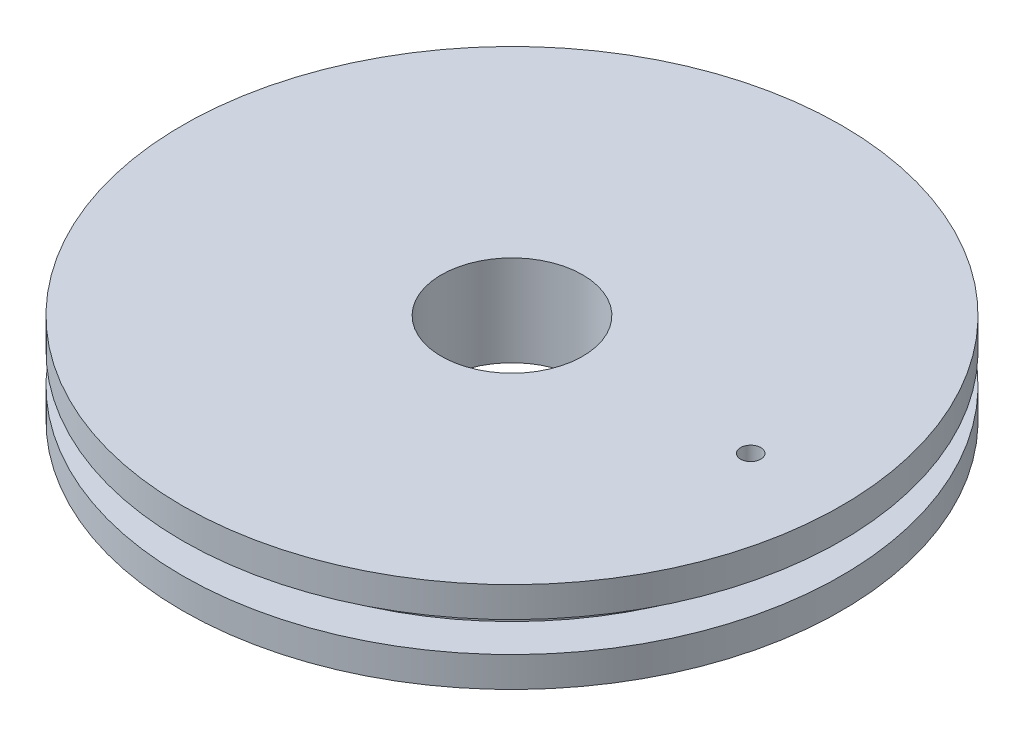
ISO-10303-21;
HEADER;
FILE_DESCRIPTION(('STEP AP214'),'2;1');
FILE_NAME('part.step','',(''),(''),'','','');
FILE_SCHEMA(('AUTOMOTIVE_DESIGN { 1 0 10303 214 1 1 1 1 }'));
ENDSEC;
DATA;
#1=APPLICATION_CONTEXT('core data for automotive mechanical design processes');
#2=APPLICATION_PROTOCOL_DEFINITION('international standard','automotive_design',2000,#1);
#3=PRODUCT_CONTEXT('',#1,'mechanical');
#4=PRODUCT('Part','Part','',(#3));
#5=PRODUCT_RELATED_PRODUCT_CATEGORY('part','',(#4));
#6=PRODUCT_DEFINITION_FORMATION('','',#4);
#7=PRODUCT_DEFINITION_CONTEXT('part definition',#1,'design');
#8=PRODUCT_DEFINITION('design','',#6,#7);
#9=PRODUCT_DEFINITION_SHAPE('','',#8);
#10=(LENGTH_UNIT() NAMED_UNIT(*) SI_UNIT(.MILLI.,.METRE.));
#11=(NAMED_UNIT(*) PLANE_ANGLE_UNIT() SI_UNIT($,.RADIAN.));
#12=(NAMED_UNIT(*) SI_UNIT($,.STERADIAN.) SOLID_ANGLE_UNIT());
#13=UNCERTAINTY_MEASURE_WITH_UNIT(LENGTH_MEASURE(1.E-05),#10,'distance_accuracy_value','');
#14=(GEOMETRIC_REPRESENTATION_CONTEXT(3) GLOBAL_UNCERTAINTY_ASSIGNED_CONTEXT((#13)) GLOBAL_UNIT_ASSIGNED_CONTEXT((#10,
#11,#12)) REPRESENTATION_CONTEXT('',''));
#15=CARTESIAN_POINT('',(0.,0.,0.));
#16=DIRECTION('',(0.,0.,1.));
#17=DIRECTION('',(1.,0.,0.));
#18=AXIS2_PLACEMENT_3D('',#15,#16,#17);
#19=CARTESIAN_POINT('',(0.,0.,0.));
#20=DIRECTION('',(0.,-1.,0.));
#21=DIRECTION('',(0.,0.,-1.));
#22=AXIS2_PLACEMENT_3D('',#19,#20,#21);
#23=CYLINDRICAL_SURFACE('',#22,32.65);
#24=CARTESIAN_POINT('',(0.,4.5,0.));
#25=DIRECTION('',(0.,-1.,0.));
#26=DIRECTION('',(0.,0.,-1.));
#27=AXIS2_PLACEMENT_3D('',#24,#25,#26);
#28=CIRCLE('',#27,32.65);
#29=CARTESIAN_POINT('',(0.,4.5,-32.65));
#30=VERTEX_POINT('',#29);
#31=EDGE_CURVE('E67',#30,#30,#28,.T.);
#32=ORIENTED_EDGE('',*,*,#31,.T.);
#33=EDGE_LOOP('',(#32));
#34=FACE_BOUND('',#33,.T.);
#35=CARTESIAN_POINT('',(0.,1.5,0.));
#36=DIRECTION('',(0.,-1.,0.));
#37=DIRECTION('',(0.,0.,-1.));
#38=AXIS2_PLACEMENT_3D('',#35,#36,#37);
#39=CIRCLE('',#38,32.65);
#40=CARTESIAN_POINT('',(0.,1.5,-32.65));
#41=VERTEX_POINT('',#40);
#42=EDGE_CURVE('E10',#41,#41,#39,.T.);
#43=ORIENTED_EDGE('',*,*,#42,.F.);
#44=EDGE_LOOP('',(#43));
#45=FACE_BOUND('',#44,.T.);
#46=ADVANCED_FACE('F39',(#34,#45),#23,.T.);
#47=CARTESIAN_POINT('',(32.65,1.5,0.));
#48=DIRECTION('',(0.,-1.,0.));
#49=DIRECTION('',(0.,0.,-1.));
#50=AXIS2_PLACEMENT_3D('',#47,#48,#49);
#51=PLANE('',#50);
#52=ORIENTED_EDGE('',*,*,#42,.T.);
#53=EDGE_LOOP('',(#52));
#54=FACE_BOUND('',#53,.T.);
#55=CARTESIAN_POINT('',(0.,1.5,0.));
#56=DIRECTION('',(0.,-1.,0.));
#57=DIRECTION('',(0.,0.,-1.));
#58=AXIS2_PLACEMENT_3D('',#55,#56,#57);
#59=CIRCLE('',#58,28.65);
#60=CARTESIAN_POINT('',(0.,1.5,-28.65));
#61=VERTEX_POINT('',#60);
#62=EDGE_CURVE('E45',#61,#61,#59,.T.);
#63=ORIENTED_EDGE('',*,*,#62,.F.);
#64=EDGE_LOOP('',(#63));
#65=FACE_BOUND('',#64,.T.);
#66=ADVANCED_FACE('F97',(#54,#65),#51,.T.);
#67=CARTESIAN_POINT('',(0.,0.,0.));
#68=DIRECTION('',(0.,-1.,0.));
#69=DIRECTION('',(0.,0.,-1.));
#70=AXIS2_PLACEMENT_3D('',#67,#68,#69);
#71=CYLINDRICAL_SURFACE('',#70,28.65);
#72=ORIENTED_EDGE('',*,*,#62,.T.);
#73=EDGE_LOOP('',(#72));
#74=FACE_BOUND('',#73,.T.);
#75=CARTESIAN_POINT('',(0.,-1.5,0.));
#76=DIRECTION('',(0.,-1.,0.));
#77=DIRECTION('',(0.,0.,-1.));
#78=AXIS2_PLACEMENT_3D('',#75,#76,#77);
#79=CIRCLE('',#78,28.65);
#80=CARTESIAN_POINT('',(0.,-1.5,-28.65));
#81=VERTEX_POINT('',#80);
#82=EDGE_CURVE('E49',#81,#81,#79,.T.);
#83=ORIENTED_EDGE('',*,*,#82,.F.);
#84=EDGE_LOOP('',(#83));
#85=FACE_BOUND('',#84,.T.);
#86=ADVANCED_FACE('F101',(#74,#85),#71,.T.);
#87=CARTESIAN_POINT('',(32.65,-1.5,0.));
#88=DIRECTION('',(0.,1.,0.));
#89=DIRECTION('',(0.,0.,1.));
#90=AXIS2_PLACEMENT_3D('',#87,#88,#89);
#91=PLANE('',#90);
#92=ORIENTED_EDGE('',*,*,#82,.T.);
#93=EDGE_LOOP('',(#92));
#94=FACE_BOUND('',#93,.T.);
#95=CARTESIAN_POINT('',(0.,-1.5,0.));
#96=DIRECTION('',(0.,-1.,0.));
#97=DIRECTION('',(0.,0.,-1.));
#98=AXIS2_PLACEMENT_3D('',#95,#96,#97);
#99=CIRCLE('',#98,32.65);
#100=CARTESIAN_POINT('',(0.,-1.5,-32.65));
#101=VERTEX_POINT('',#100);
#102=EDGE_CURVE('E53',#101,#101,#99,.T.);
#103=ORIENTED_EDGE('',*,*,#102,.F.);
#104=EDGE_LOOP('',(#103));
#105=FACE_BOUND('',#104,.T.);
#106=ADVANCED_FACE('F105',(#94,#105),#91,.T.);
#107=CARTESIAN_POINT('',(0.,0.,0.));
#108=DIRECTION('',(0.,-1.,0.));
#109=DIRECTION('',(0.,0.,-1.));
#110=AXIS2_PLACEMENT_3D('',#107,#108,#109);
#111=CYLINDRICAL_SURFACE('',#110,32.65);
#112=ORIENTED_EDGE('',*,*,#102,.T.);
#113=EDGE_LOOP('',(#112));
#114=FACE_BOUND('',#113,.T.);
#115=CARTESIAN_POINT('',(0.,-4.5,0.));
#116=DIRECTION('',(0.,-1.,0.));
#117=DIRECTION('',(0.,0.,-1.));
#118=AXIS2_PLACEMENT_3D('',#115,#116,#117);
#119=CIRCLE('',#118,32.65);
#120=CARTESIAN_POINT('',(0.,-4.5,-32.65));
#121=VERTEX_POINT('',#120);
#122=EDGE_CURVE('E58',#121,#121,#119,.T.);
#123=ORIENTED_EDGE('',*,*,#122,.F.);
#124=EDGE_LOOP('',(#123));
#125=FACE_BOUND('',#124,.T.);
#126=ADVANCED_FACE('F111',(#114,#125),#111,.T.);
#127=CARTESIAN_POINT('',(7.,-4.5,0.));
#128=DIRECTION('',(0.,-1.,0.));
#129=DIRECTION('',(0.,0.,-1.));
#130=AXIS2_PLACEMENT_3D('',#127,#128,#129);
#131=PLANE('',#130);
#132=CARTESIAN_POINT('',(23.65,-4.5,0.));
#133=DIRECTION('',(0.,1.,0.));
#134=DIRECTION('',(0.,0.,1.));
#135=AXIS2_PLACEMENT_3D('',#132,#133,#134);
#136=CIRCLE('',#135,1.);
#137=CARTESIAN_POINT('',(23.65,-4.5,1.));
#138=VERTEX_POINT('',#137);
#139=EDGE_CURVE('E70',#138,#138,#136,.T.);
#140=ORIENTED_EDGE('',*,*,#139,.T.);
#141=EDGE_LOOP('',(#140));
#142=FACE_BOUND('',#141,.T.);
#143=ORIENTED_EDGE('',*,*,#122,.T.);
#144=EDGE_LOOP('',(#143));
#145=FACE_BOUND('',#144,.T.);
#146=CARTESIAN_POINT('',(0.,-4.5,0.));
#147=DIRECTION('',(0.,-1.,0.));
#148=DIRECTION('',(0.,0.,-1.));
#149=AXIS2_PLACEMENT_3D('',#146,#147,#148);
#150=CIRCLE('',#149,7.);
#151=CARTESIAN_POINT('',(0.,-4.5,-7.));
#152=VERTEX_POINT('',#151);
#153=EDGE_CURVE('E61',#152,#152,#150,.T.);
#154=ORIENTED_EDGE('',*,*,#153,.F.);
#155=EDGE_LOOP('',(#154));
#156=FACE_BOUND('',#155,.T.);
#157=ADVANCED_FACE('F77',(#142,#145,#156),#131,.T.);
#158=CARTESIAN_POINT('',(0.,0.,0.));
#159=DIRECTION('',(0.,-1.,0.));
#160=DIRECTION('',(0.,0.,-1.));
#161=AXIS2_PLACEMENT_3D('',#158,#159,#160);
#162=CYLINDRICAL_SURFACE('',#161,7.);
#163=ORIENTED_EDGE('',*,*,#153,.T.);
#164=EDGE_LOOP('',(#163));
#165=FACE_BOUND('',#164,.T.);
#166=CARTESIAN_POINT('',(0.,4.5,0.));
#167=DIRECTION('',(0.,-1.,0.));
#168=DIRECTION('',(0.,0.,-1.));
#169=AXIS2_PLACEMENT_3D('',#166,#167,#168);
#170=CIRCLE('',#169,7.);
#171=CARTESIAN_POINT('',(0.,4.5,-7.));
#172=VERTEX_POINT('',#171);
#173=EDGE_CURVE('E64',#172,#172,#170,.T.);
#174=ORIENTED_EDGE('',*,*,#173,.F.);
#175=EDGE_LOOP('',(#174));
#176=FACE_BOUND('',#175,.T.);
#177=ADVANCED_FACE('F89',(#165,#176),#162,.F.);
#178=CARTESIAN_POINT('',(7.,4.5,0.));
#179=DIRECTION('',(0.,1.,0.));
#180=DIRECTION('',(0.,0.,1.));
#181=AXIS2_PLACEMENT_3D('',#178,#179,#180);
#182=PLANE('',#181);
#183=CARTESIAN_POINT('',(23.65,4.5,0.));
#184=DIRECTION('',(0.,1.,0.));
#185=DIRECTION('',(0.,0.,1.));
#186=AXIS2_PLACEMENT_3D('',#183,#184,#185);
#187=CIRCLE('',#186,1.);
#188=CARTESIAN_POINT('',(23.65,4.5,1.));
#189=VERTEX_POINT('',#188);
#190=EDGE_CURVE('E71',#189,#189,#187,.T.);
#191=ORIENTED_EDGE('',*,*,#190,.F.);
#192=EDGE_LOOP('',(#191));
#193=FACE_BOUND('',#192,.T.);
#194=ORIENTED_EDGE('',*,*,#173,.T.);
#195=EDGE_LOOP('',(#194));
#196=FACE_BOUND('',#195,.T.);
#197=ORIENTED_EDGE('',*,*,#31,.F.);
#198=EDGE_LOOP('',(#197));
#199=FACE_BOUND('',#198,.T.);
#200=ADVANCED_FACE('F83',(#193,#196,#199),#182,.T.);
#201=CARTESIAN_POINT('',(23.65,-4.5,0.));
#202=DIRECTION('',(0.,1.,0.));
#203=DIRECTION('',(0.,0.,1.));
#204=AXIS2_PLACEMENT_3D('',#201,#202,#203);
#205=CYLINDRICAL_SURFACE('',#204,1.);
#206=ORIENTED_EDGE('',*,*,#139,.F.);
#207=EDGE_LOOP('',(#206));
#208=FACE_BOUND('',#207,.T.);
#209=ORIENTED_EDGE('',*,*,#190,.T.);
#210=EDGE_LOOP('',(#209));
#211=FACE_BOUND('',#210,.T.);
#212=ADVANCED_FACE('F80',(#208,#211),#205,.F.);
#213=CLOSED_SHELL('',(#46,#66,#86,#106,#126,#157,#177,#200,#212));
#214=MANIFOLD_SOLID_BREP('B2',#213);
#215=ADVANCED_BREP_SHAPE_REPRESENTATION('',(#18,#214),#14);
#216=SHAPE_DEFINITION_REPRESENTATION(#9,#215);
ENDSEC;
END-ISO-10303-21;
